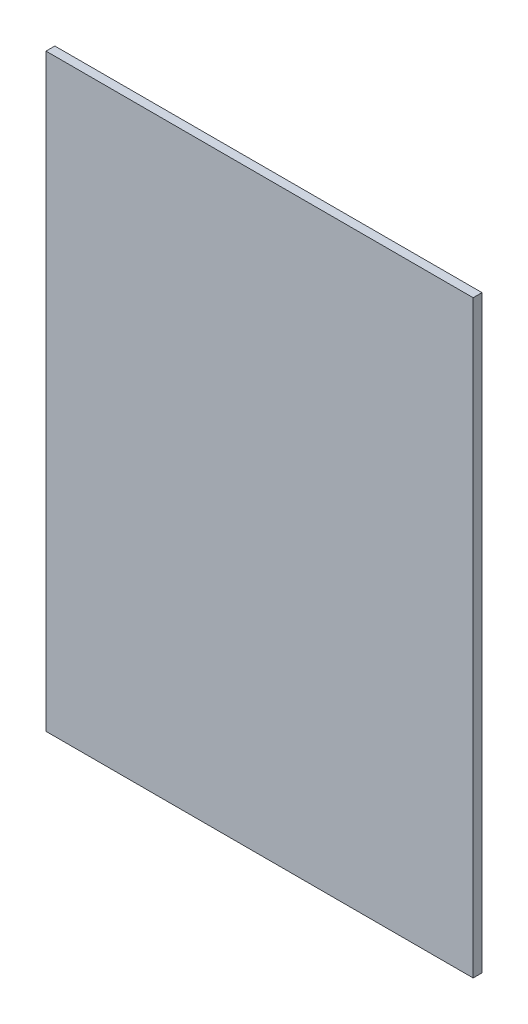
ISO-10303-21;
HEADER;
FILE_DESCRIPTION(('STEP AP214'),'2;1');
FILE_NAME('part.step','',(''),(''),'','','');
FILE_SCHEMA(('AUTOMOTIVE_DESIGN { 1 0 10303 214 1 1 1 1 }'));
ENDSEC;
DATA;
#1=APPLICATION_CONTEXT('core data for automotive mechanical design processes');
#2=APPLICATION_PROTOCOL_DEFINITION('international standard','automotive_design',2000,#1);
#3=PRODUCT_CONTEXT('',#1,'mechanical');
#4=PRODUCT('Part','Part','',(#3));
#5=PRODUCT_RELATED_PRODUCT_CATEGORY('part','',(#4));
#6=PRODUCT_DEFINITION_FORMATION('','',#4);
#7=PRODUCT_DEFINITION_CONTEXT('part definition',#1,'design');
#8=PRODUCT_DEFINITION('design','',#6,#7);
#9=PRODUCT_DEFINITION_SHAPE('','',#8);
#10=(LENGTH_UNIT() NAMED_UNIT(*) SI_UNIT(.MILLI.,.METRE.));
#11=(NAMED_UNIT(*) PLANE_ANGLE_UNIT() SI_UNIT($,.RADIAN.));
#12=(NAMED_UNIT(*) SI_UNIT($,.STERADIAN.) SOLID_ANGLE_UNIT());
#13=UNCERTAINTY_MEASURE_WITH_UNIT(LENGTH_MEASURE(1.E-05),#10,'distance_accuracy_value','');
#14=(GEOMETRIC_REPRESENTATION_CONTEXT(3) GLOBAL_UNCERTAINTY_ASSIGNED_CONTEXT((#13)) GLOBAL_UNIT_ASSIGNED_CONTEXT((#10,
#11,#12)) REPRESENTATION_CONTEXT('',''));
#15=CARTESIAN_POINT('',(0.,0.,0.));
#16=DIRECTION('',(0.,0.,1.));
#17=DIRECTION('',(1.,0.,0.));
#18=AXIS2_PLACEMENT_3D('',#15,#16,#17);
#19=CARTESIAN_POINT('',(72.5,-100.,3.));
#20=DIRECTION('',(-1.,0.,0.));
#21=DIRECTION('',(0.,0.,1.));
#22=AXIS2_PLACEMENT_3D('',#19,#20,#21);
#23=PLANE('',#22);
#24=DIRECTION('',(0.,1.,0.));
#25=VECTOR('',#24,1.);
#26=CARTESIAN_POINT('',(72.5,-100.,0.));
#27=LINE('',#26,#25);
#28=CARTESIAN_POINT('',(72.5,-100.,0.));
#29=VERTEX_POINT('',#28);
#30=CARTESIAN_POINT('',(72.5,100.,0.));
#31=VERTEX_POINT('',#30);
#32=EDGE_CURVE('E102',#29,#31,#27,.T.);
#33=ORIENTED_EDGE('',*,*,#32,.T.);
#34=DIRECTION('',(0.,0.,-1.));
#35=VECTOR('',#34,1.);
#36=CARTESIAN_POINT('',(72.5,100.,3.));
#37=LINE('',#36,#35);
#38=CARTESIAN_POINT('',(72.5,100.,3.));
#39=VERTEX_POINT('',#38);
#40=EDGE_CURVE('E11',#39,#31,#37,.T.);
#41=ORIENTED_EDGE('',*,*,#40,.F.);
#42=DIRECTION('',(0.,1.,0.));
#43=VECTOR('',#42,1.);
#44=CARTESIAN_POINT('',(72.5,-100.,3.));
#45=LINE('',#44,#43);
#46=CARTESIAN_POINT('',(72.5,-100.,3.));
#47=VERTEX_POINT('',#46);
#48=EDGE_CURVE('E90',#47,#39,#45,.T.);
#49=ORIENTED_EDGE('',*,*,#48,.F.);
#50=DIRECTION('',(0.,0.,-1.));
#51=VECTOR('',#50,1.);
#52=CARTESIAN_POINT('',(72.5,-100.,3.));
#53=LINE('',#52,#51);
#54=EDGE_CURVE('E98',#47,#29,#53,.T.);
#55=ORIENTED_EDGE('',*,*,#54,.T.);
#56=EDGE_LOOP('',(#33,#41,#49,#55));
#57=FACE_BOUND('',#56,.T.);
#58=ADVANCED_FACE('F39',(#57),#23,.F.);
#59=CARTESIAN_POINT('',(-72.5,100.,3.));
#60=DIRECTION('',(0.,-1.,0.));
#61=DIRECTION('',(0.,0.,-1.));
#62=AXIS2_PLACEMENT_3D('',#59,#60,#61);
#63=PLANE('',#62);
#64=DIRECTION('',(-1.,0.,0.));
#65=VECTOR('',#64,1.);
#66=CARTESIAN_POINT('',(-72.5,100.,0.));
#67=LINE('',#66,#65);
#68=CARTESIAN_POINT('',(-72.5,100.,0.));
#69=VERTEX_POINT('',#68);
#70=EDGE_CURVE('E94',#31,#69,#67,.T.);
#71=ORIENTED_EDGE('',*,*,#70,.T.);
#72=DIRECTION('',(0.,0.,-1.));
#73=VECTOR('',#72,1.);
#74=CARTESIAN_POINT('',(-72.5,100.,3.));
#75=LINE('',#74,#73);
#76=CARTESIAN_POINT('',(-72.5,100.,3.));
#77=VERTEX_POINT('',#76);
#78=EDGE_CURVE('E47',#77,#69,#75,.T.);
#79=ORIENTED_EDGE('',*,*,#78,.F.);
#80=DIRECTION('',(-1.,0.,0.));
#81=VECTOR('',#80,1.);
#82=CARTESIAN_POINT('',(-72.5,100.,3.));
#83=LINE('',#82,#81);
#84=EDGE_CURVE('E85',#39,#77,#83,.T.);
#85=ORIENTED_EDGE('',*,*,#84,.F.);
#86=ORIENTED_EDGE('',*,*,#40,.T.);
#87=EDGE_LOOP('',(#71,#79,#85,#86));
#88=FACE_BOUND('',#87,.T.);
#89=ADVANCED_FACE('F93',(#88),#63,.F.);
#90=CARTESIAN_POINT('',(-72.5,-100.,3.));
#91=DIRECTION('',(1.,0.,0.));
#92=DIRECTION('',(0.,0.,-1.));
#93=AXIS2_PLACEMENT_3D('',#90,#91,#92);
#94=PLANE('',#93);
#95=DIRECTION('',(0.,-1.,0.));
#96=VECTOR('',#95,1.);
#97=CARTESIAN_POINT('',(-72.5,-100.,0.));
#98=LINE('',#97,#96);
#99=CARTESIAN_POINT('',(-72.5,-100.,0.));
#100=VERTEX_POINT('',#99);
#101=EDGE_CURVE('E72',#69,#100,#98,.T.);
#102=ORIENTED_EDGE('',*,*,#101,.T.);
#103=DIRECTION('',(0.,0.,-1.));
#104=VECTOR('',#103,1.);
#105=CARTESIAN_POINT('',(-72.5,-100.,3.));
#106=LINE('',#105,#104);
#107=CARTESIAN_POINT('',(-72.5,-100.,3.));
#108=VERTEX_POINT('',#107);
#109=EDGE_CURVE('E95',#108,#100,#106,.T.);
#110=ORIENTED_EDGE('',*,*,#109,.F.);
#111=DIRECTION('',(0.,-1.,0.));
#112=VECTOR('',#111,1.);
#113=CARTESIAN_POINT('',(-72.5,-100.,3.));
#114=LINE('',#113,#112);
#115=EDGE_CURVE('E88',#77,#108,#114,.T.);
#116=ORIENTED_EDGE('',*,*,#115,.F.);
#117=ORIENTED_EDGE('',*,*,#78,.T.);
#118=EDGE_LOOP('',(#102,#110,#116,#117));
#119=FACE_BOUND('',#118,.T.);
#120=ADVANCED_FACE('F96',(#119),#94,.F.);
#121=CARTESIAN_POINT('',(-72.5,-100.,3.));
#122=DIRECTION('',(0.,1.,0.));
#123=DIRECTION('',(0.,0.,1.));
#124=AXIS2_PLACEMENT_3D('',#121,#122,#123);
#125=PLANE('',#124);
#126=DIRECTION('',(1.,0.,0.));
#127=VECTOR('',#126,1.);
#128=CARTESIAN_POINT('',(-72.5,-100.,0.));
#129=LINE('',#128,#127);
#130=EDGE_CURVE('E78',#100,#29,#129,.T.);
#131=ORIENTED_EDGE('',*,*,#130,.T.);
#132=ORIENTED_EDGE('',*,*,#54,.F.);
#133=DIRECTION('',(1.,0.,0.));
#134=VECTOR('',#133,1.);
#135=CARTESIAN_POINT('',(-72.5,-100.,3.));
#136=LINE('',#135,#134);
#137=EDGE_CURVE('E55',#108,#47,#136,.T.);
#138=ORIENTED_EDGE('',*,*,#137,.F.);
#139=ORIENTED_EDGE('',*,*,#109,.T.);
#140=EDGE_LOOP('',(#131,#132,#138,#139));
#141=FACE_BOUND('',#140,.T.);
#142=ADVANCED_FACE('F109',(#141),#125,.F.);
#143=CARTESIAN_POINT('',(0.,0.,3.));
#144=DIRECTION('',(0.,0.,-1.));
#145=DIRECTION('',(-1.,0.,0.));
#146=AXIS2_PLACEMENT_3D('',#143,#144,#145);
#147=PLANE('',#146);
#148=ORIENTED_EDGE('',*,*,#48,.T.);
#149=ORIENTED_EDGE('',*,*,#84,.T.);
#150=ORIENTED_EDGE('',*,*,#115,.T.);
#151=ORIENTED_EDGE('',*,*,#137,.T.);
#152=EDGE_LOOP('',(#148,#149,#150,#151));
#153=FACE_BOUND('',#152,.T.);
#154=ADVANCED_FACE('F86',(#153),#147,.F.);
#155=CARTESIAN_POINT('',(0.,0.,0.));
#156=DIRECTION('',(0.,0.,-1.));
#157=DIRECTION('',(-1.,0.,0.));
#158=AXIS2_PLACEMENT_3D('',#155,#156,#157);
#159=PLANE('',#158);
#160=ORIENTED_EDGE('',*,*,#32,.F.);
#161=ORIENTED_EDGE('',*,*,#130,.F.);
#162=ORIENTED_EDGE('',*,*,#101,.F.);
#163=ORIENTED_EDGE('',*,*,#70,.F.);
#164=EDGE_LOOP('',(#160,#161,#162,#163));
#165=FACE_BOUND('',#164,.T.);
#166=ADVANCED_FACE('F112',(#165),#159,.T.);
#167=CLOSED_SHELL('',(#58,#89,#120,#142,#154,#166));
#168=MANIFOLD_SOLID_BREP('B2',#167);
#169=ADVANCED_BREP_SHAPE_REPRESENTATION('',(#18,#168),#14);
#170=SHAPE_DEFINITION_REPRESENTATION(#9,#169);
ENDSEC;
END-ISO-10303-21;
